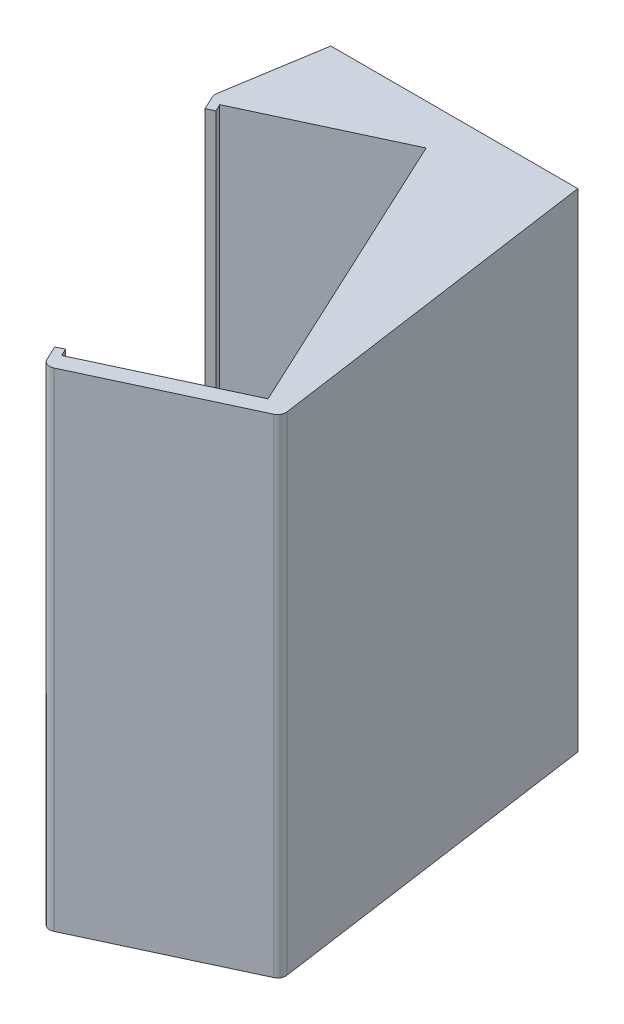
ISO-10303-21;
HEADER;
FILE_DESCRIPTION(('STEP AP214'),'2;1');
FILE_NAME('part.step','',(''),(''),'','','');
FILE_SCHEMA(('AUTOMOTIVE_DESIGN { 1 0 10303 214 1 1 1 1 }'));
ENDSEC;
DATA;
#1=APPLICATION_CONTEXT('core data for automotive mechanical design processes');
#2=APPLICATION_PROTOCOL_DEFINITION('international standard','automotive_design',2000,#1);
#3=PRODUCT_CONTEXT('',#1,'mechanical');
#4=PRODUCT('Part','Part','',(#3));
#5=PRODUCT_RELATED_PRODUCT_CATEGORY('part','',(#4));
#6=PRODUCT_DEFINITION_FORMATION('','',#4);
#7=PRODUCT_DEFINITION_CONTEXT('part definition',#1,'design');
#8=PRODUCT_DEFINITION('design','',#6,#7);
#9=PRODUCT_DEFINITION_SHAPE('','',#8);
#10=(LENGTH_UNIT() NAMED_UNIT(*) SI_UNIT(.MILLI.,.METRE.));
#11=(NAMED_UNIT(*) PLANE_ANGLE_UNIT() SI_UNIT($,.RADIAN.));
#12=(NAMED_UNIT(*) SI_UNIT($,.STERADIAN.) SOLID_ANGLE_UNIT());
#13=UNCERTAINTY_MEASURE_WITH_UNIT(LENGTH_MEASURE(1.E-05),#10,'distance_accuracy_value','');
#14=(GEOMETRIC_REPRESENTATION_CONTEXT(3) GLOBAL_UNCERTAINTY_ASSIGNED_CONTEXT((#13)) GLOBAL_UNIT_ASSIGNED_CONTEXT((#10,
#11,#12)) REPRESENTATION_CONTEXT('',''));
#15=CARTESIAN_POINT('',(0.,0.,0.));
#16=DIRECTION('',(0.,0.,1.));
#17=DIRECTION('',(1.,0.,0.));
#18=AXIS2_PLACEMENT_3D('',#15,#16,#17);
#19=CARTESIAN_POINT('',(-0.321224610422263,60.,44.5055818381207));
#20=DIRECTION('',(-0.906307787036635,0.,0.422618261740732));
#21=DIRECTION('',(0.422618261740732,0.,0.906307787036635));
#22=AXIS2_PLACEMENT_3D('',#19,#20,#21);
#23=PLANE('',#22);
#24=DIRECTION('',(-0.422618261740732,0.,-0.906307787036635));
#25=VECTOR('',#24,1.);
#26=CARTESIAN_POINT('',(-0.321224610422263,0.,44.5055818381207));
#27=LINE('',#26,#25);
#28=CARTESIAN_POINT('',(-0.321224610422263,0.,44.5055818381207));
#29=VERTEX_POINT('',#28);
#30=CARTESIAN_POINT('',(-0.743842872162994,0.,43.5992740510841));
#31=VERTEX_POINT('',#30);
#32=EDGE_CURVE('E178',#29,#31,#27,.T.);
#33=ORIENTED_EDGE('',*,*,#32,.T.);
#34=DIRECTION('',(0.,-1.,0.));
#35=VECTOR('',#34,1.);
#36=CARTESIAN_POINT('',(-0.743842872162994,60.,43.5992740510841));
#37=LINE('',#36,#35);
#38=CARTESIAN_POINT('',(-0.743842872162994,60.,43.5992740510841));
#39=VERTEX_POINT('',#38);
#40=EDGE_CURVE('E156',#39,#31,#37,.T.);
#41=ORIENTED_EDGE('',*,*,#40,.F.);
#42=DIRECTION('',(-0.422618261740732,0.,-0.906307787036635));
#43=VECTOR('',#42,1.);
#44=CARTESIAN_POINT('',(-0.321224610422263,60.,44.5055818381207));
#45=LINE('',#44,#43);
#46=CARTESIAN_POINT('',(-0.321224610422263,60.,44.5055818381207));
#47=VERTEX_POINT('',#46);
#48=EDGE_CURVE('E162',#47,#39,#45,.T.);
#49=ORIENTED_EDGE('',*,*,#48,.F.);
#50=DIRECTION('',(0.,-1.,0.));
#51=VECTOR('',#50,1.);
#52=CARTESIAN_POINT('',(-0.321224610422263,60.,44.5055818381207));
#53=LINE('',#52,#51);
#54=EDGE_CURVE('E232',#47,#29,#53,.T.);
#55=ORIENTED_EDGE('',*,*,#54,.T.);
#56=EDGE_LOOP('',(#33,#41,#49,#55));
#57=FACE_BOUND('',#56,.T.);
#58=ADVANCED_FACE('F39',(#57),#23,.F.);
#59=CARTESIAN_POINT('',(-0.743842872162994,60.,43.5992740510841));
#60=DIRECTION('',(0.422618261740733,0.,0.906307787036634));
#61=DIRECTION('',(0.906307787036634,0.,-0.422618261740733));
#62=AXIS2_PLACEMENT_3D('',#59,#60,#61);
#63=PLANE('',#62);
#64=DIRECTION('',(-0.906307787036634,0.,0.422618261740733));
#65=VECTOR('',#64,1.);
#66=CARTESIAN_POINT('',(-0.743842872162994,0.,43.5992740510841));
#67=LINE('',#66,#65);
#68=CARTESIAN_POINT('',(-1.65015065919963,0.,44.0218923128248));
#69=VERTEX_POINT('',#68);
#70=EDGE_CURVE('E269',#31,#69,#67,.T.);
#71=ORIENTED_EDGE('',*,*,#70,.T.);
#72=DIRECTION('',(0.,-1.,0.));
#73=VECTOR('',#72,1.);
#74=CARTESIAN_POINT('',(-1.65015065919963,60.,44.0218923128248));
#75=LINE('',#74,#73);
#76=CARTESIAN_POINT('',(-1.65015065919963,60.,44.0218923128248));
#77=VERTEX_POINT('',#76);
#78=EDGE_CURVE('E157',#77,#69,#75,.T.);
#79=ORIENTED_EDGE('',*,*,#78,.F.);
#80=DIRECTION('',(-0.906307787036634,0.,0.422618261740733));
#81=VECTOR('',#80,1.);
#82=CARTESIAN_POINT('',(-0.743842872162994,60.,43.5992740510841));
#83=LINE('',#82,#81);
#84=EDGE_CURVE('E155',#39,#77,#83,.T.);
#85=ORIENTED_EDGE('',*,*,#84,.F.);
#86=ORIENTED_EDGE('',*,*,#40,.T.);
#87=EDGE_LOOP('',(#71,#79,#85,#86));
#88=FACE_BOUND('',#87,.T.);
#89=ADVANCED_FACE('F152',(#88),#63,.F.);
#90=CARTESIAN_POINT('',(-1.65015065919963,60.,44.0218923128248));
#91=DIRECTION('',(0.906307787036634,0.,-0.422618261740734));
#92=DIRECTION('',(-0.422618261740734,0.,-0.906307787036634));
#93=AXIS2_PLACEMENT_3D('',#90,#91,#92);
#94=PLANE('',#93);
#95=DIRECTION('',(0.422618261740734,0.,0.906307787036634));
#96=VECTOR('',#95,1.);
#97=CARTESIAN_POINT('',(-1.65015065919963,0.,44.0218923128248));
#98=LINE('',#97,#96);
#99=CARTESIAN_POINT('',(-0.804914135718137,0.,45.8345078868981));
#100=VERTEX_POINT('',#99);
#101=EDGE_CURVE('E270',#69,#100,#98,.T.);
#102=ORIENTED_EDGE('',*,*,#101,.T.);
#103=DIRECTION('',(0.,-1.,0.));
#104=VECTOR('',#103,1.);
#105=CARTESIAN_POINT('',(-0.804914135718136,60.,45.8345078868981));
#106=LINE('',#105,#104);
#107=CARTESIAN_POINT('',(-0.804914135718137,60.,45.8345078868981));
#108=VERTEX_POINT('',#107);
#109=EDGE_CURVE('E11',#100,#108,#106,.F.);
#110=ORIENTED_EDGE('',*,*,#109,.T.);
#111=DIRECTION('',(0.422618261740734,0.,0.906307787036634));
#112=VECTOR('',#111,1.);
#113=CARTESIAN_POINT('',(-1.65015065919963,60.,44.0218923128248));
#114=LINE('',#113,#112);
#115=EDGE_CURVE('E165',#77,#108,#114,.T.);
#116=ORIENTED_EDGE('',*,*,#115,.F.);
#117=ORIENTED_EDGE('',*,*,#78,.T.);
#118=EDGE_LOOP('',(#102,#110,#116,#117));
#119=FACE_BOUND('',#118,.T.);
#120=ADVANCED_FACE('F325',(#119),#94,.F.);
#121=CARTESIAN_POINT('',(-0.382295873977423,60.,46.7408156739347));
#122=DIRECTION('',(-0.42261826174069,0.,-0.906307787036654));
#123=DIRECTION('',(-0.906307787036654,0.,0.42261826174069));
#124=AXIS2_PLACEMENT_3D('',#121,#122,#123);
#125=PLANE('',#124);
#126=DIRECTION('',(0.906307787036654,0.,-0.42261826174069));
#127=VECTOR('',#126,1.);
#128=CARTESIAN_POINT('',(-0.382295873977423,0.,46.7408156739347));
#129=LINE('',#128,#127);
#130=CARTESIAN_POINT('',(0.524011913059188,0.,46.318197412194));
#131=VERTEX_POINT('',#130);
#132=CARTESIAN_POINT('',(18.9758096712909,0.,37.7139828108036));
#133=VERTEX_POINT('',#132);
#134=EDGE_CURVE('E265',#131,#133,#129,.T.);
#135=ORIENTED_EDGE('',*,*,#134,.T.);
#136=DIRECTION('',(0.,-1.,0.));
#137=VECTOR('',#136,1.);
#138=CARTESIAN_POINT('',(18.9758096712909,60.,37.7139828108036));
#139=LINE('',#138,#137);
#140=CARTESIAN_POINT('',(18.9758096712909,60.,37.7139828108036));
#141=VERTEX_POINT('',#140);
#142=EDGE_CURVE('E195',#133,#141,#139,.F.);
#143=ORIENTED_EDGE('',*,*,#142,.T.);
#144=DIRECTION('',(0.906307787036654,0.,-0.42261826174069));
#145=VECTOR('',#144,1.);
#146=CARTESIAN_POINT('',(-0.382295873977423,60.,46.7408156739347));
#147=LINE('',#146,#145);
#148=CARTESIAN_POINT('',(0.524011913059188,60.,46.318197412194));
#149=VERTEX_POINT('',#148);
#150=EDGE_CURVE('E287',#149,#141,#147,.T.);
#151=ORIENTED_EDGE('',*,*,#150,.F.);
#152=DIRECTION('',(0.,-1.,0.));
#153=VECTOR('',#152,1.);
#154=CARTESIAN_POINT('',(0.524011913059188,60.,46.318197412194));
#155=LINE('',#154,#153);
#156=EDGE_CURVE('E193',#149,#131,#155,.T.);
#157=ORIENTED_EDGE('',*,*,#156,.T.);
#158=EDGE_LOOP('',(#135,#143,#151,#157));
#159=FACE_BOUND('',#158,.T.);
#160=ADVANCED_FACE('F297',(#159),#125,.F.);
#161=CARTESIAN_POINT('',(19.6471062123607,60.,37.4009520928098));
#162=DIRECTION('',(-0.990135884384228,0.,0.140110422362728));
#163=DIRECTION('',(0.140110422362728,0.,0.990135884384228));
#164=AXIS2_PLACEMENT_3D('',#161,#162,#163);
#165=PLANE('',#164);
#166=DIRECTION('',(-0.140110422362728,0.,-0.990135884384228));
#167=VECTOR('',#166,1.);
#168=CARTESIAN_POINT('',(19.6471062123607,60.,37.4009520928098));
#169=LINE('',#168,#167);
#170=CARTESIAN_POINT('',(19.5433272939344,60.,36.6675646014042));
#171=VERTEX_POINT('',#170);
#172=CARTESIAN_POINT('',(13.6471062123606,60.,-5.));
#173=VERTEX_POINT('',#172);
#174=EDGE_CURVE('E288',#171,#173,#169,.T.);
#175=ORIENTED_EDGE('',*,*,#174,.F.);
#176=DIRECTION('',(0.,-1.,0.));
#177=VECTOR('',#176,1.);
#178=CARTESIAN_POINT('',(19.5433272939344,60.,36.6675646014042));
#179=LINE('',#178,#177);
#180=CARTESIAN_POINT('',(19.5433272939344,0.,36.6675646014042));
#181=VERTEX_POINT('',#180);
#182=EDGE_CURVE('E179',#171,#181,#179,.T.);
#183=ORIENTED_EDGE('',*,*,#182,.T.);
#184=DIRECTION('',(-0.140110422362728,0.,-0.990135884384228));
#185=VECTOR('',#184,1.);
#186=CARTESIAN_POINT('',(19.6471062123607,0.,37.4009520928098));
#187=LINE('',#186,#185);
#188=CARTESIAN_POINT('',(13.6471062123606,0.,-5.));
#189=VERTEX_POINT('',#188);
#190=EDGE_CURVE('E261',#181,#189,#187,.T.);
#191=ORIENTED_EDGE('',*,*,#190,.T.);
#192=DIRECTION('',(0.,-1.,0.));
#193=VECTOR('',#192,1.);
#194=CARTESIAN_POINT('',(13.6471062123606,60.,-5.));
#195=LINE('',#194,#193);
#196=EDGE_CURVE('E185',#173,#189,#195,.T.);
#197=ORIENTED_EDGE('',*,*,#196,.F.);
#198=EDGE_LOOP('',(#175,#183,#191,#197));
#199=FACE_BOUND('',#198,.T.);
#200=ADVANCED_FACE('F301',(#199),#165,.F.);
#201=CARTESIAN_POINT('',(13.6471062123606,60.,-5.));
#202=DIRECTION('',(0.,0.,1.));
#203=DIRECTION('',(1.,0.,0.));
#204=AXIS2_PLACEMENT_3D('',#201,#202,#203);
#205=PLANE('',#204);
#206=DIRECTION('',(-1.,0.,0.));
#207=VECTOR('',#206,1.);
#208=CARTESIAN_POINT('',(13.6471062123606,0.,-5.));
#209=LINE('',#208,#207);
#210=CARTESIAN_POINT('',(-16.7267835740057,0.,-5.));
#211=VERTEX_POINT('',#210);
#212=EDGE_CURVE('E224',#189,#211,#209,.T.);
#213=ORIENTED_EDGE('',*,*,#212,.T.);
#214=DIRECTION('',(0.,-1.,0.));
#215=VECTOR('',#214,1.);
#216=CARTESIAN_POINT('',(-16.7267835740057,60.,-5.));
#217=LINE('',#216,#215);
#218=CARTESIAN_POINT('',(-16.7267835740057,60.,-5.));
#219=VERTEX_POINT('',#218);
#220=EDGE_CURVE('E250',#219,#211,#217,.T.);
#221=ORIENTED_EDGE('',*,*,#220,.F.);
#222=DIRECTION('',(-1.,0.,0.));
#223=VECTOR('',#222,1.);
#224=CARTESIAN_POINT('',(13.6471062123606,60.,-5.));
#225=LINE('',#224,#223);
#226=EDGE_CURVE('E256',#173,#219,#225,.T.);
#227=ORIENTED_EDGE('',*,*,#226,.F.);
#228=ORIENTED_EDGE('',*,*,#196,.T.);
#229=EDGE_LOOP('',(#213,#221,#227,#228));
#230=FACE_BOUND('',#229,.T.);
#231=ADVANCED_FACE('F258',(#230),#205,.F.);
#232=CARTESIAN_POINT('',(-18.7267835740057,60.,7.40093484802536));
#233=DIRECTION('',(0.987243007651359,0.,0.159220739363623));
#234=DIRECTION('',(0.159220739363623,0.,-0.987243007651359));
#235=AXIS2_PLACEMENT_3D('',#232,#233,#234);
#236=PLANE('',#235);
#237=DIRECTION('',(-0.159220739363623,0.,0.987243007651359));
#238=VECTOR('',#237,1.);
#239=CARTESIAN_POINT('',(-18.7267835740057,0.,7.40093484802536));
#240=LINE('',#239,#238);
#241=CARTESIAN_POINT('',(-18.6778591742979,0.,7.09758070139748));
#242=VERTEX_POINT('',#241);
#243=EDGE_CURVE('E218',#211,#242,#240,.T.);
#244=ORIENTED_EDGE('',*,*,#243,.T.);
#245=DIRECTION('',(0.,-1.,0.));
#246=VECTOR('',#245,1.);
#247=CARTESIAN_POINT('',(-18.6778591742979,60.,7.09758070139748));
#248=LINE('',#247,#246);
#249=CARTESIAN_POINT('',(-18.6778591742979,60.,7.09758070139748));
#250=VERTEX_POINT('',#249);
#251=EDGE_CURVE('E50',#242,#250,#248,.F.);
#252=ORIENTED_EDGE('',*,*,#251,.T.);
#253=DIRECTION('',(-0.159220739363623,0.,0.987243007651359));
#254=VECTOR('',#253,1.);
#255=CARTESIAN_POINT('',(-18.7267835740057,60.,7.40093484802536));
#256=LINE('',#255,#254);
#257=EDGE_CURVE('E282',#219,#250,#256,.T.);
#258=ORIENTED_EDGE('',*,*,#257,.F.);
#259=ORIENTED_EDGE('',*,*,#220,.T.);
#260=EDGE_LOOP('',(#244,#252,#258,#259));
#261=FACE_BOUND('',#260,.T.);
#262=ADVANCED_FACE('F308',(#261),#236,.F.);
#263=CARTESIAN_POINT('',(-17.7941682576956,60.,9.40093484802536));
#264=DIRECTION('',(0.906307787036634,0.,-0.422618261740733));
#265=DIRECTION('',(-0.422618261740733,0.,-0.906307787036634));
#266=AXIS2_PLACEMENT_3D('',#263,#264,#265);
#267=PLANE('',#266);
#268=DIRECTION('',(0.422618261740733,0.,0.906307787036634));
#269=VECTOR('',#268,1.);
#270=CARTESIAN_POINT('',(-17.7941682576956,60.,9.40093484802536));
#271=LINE('',#270,#269);
#272=CARTESIAN_POINT('',(-18.5969239536831,60.,7.67941970250183));
#273=VERTEX_POINT('',#272);
#274=CARTESIAN_POINT('',(-17.7941682576956,60.,9.40093484802536));
#275=VERTEX_POINT('',#274);
#276=EDGE_CURVE('E209',#273,#275,#271,.T.);
#277=ORIENTED_EDGE('',*,*,#276,.F.);
#278=DIRECTION('',(0.,-1.,0.));
#279=VECTOR('',#278,1.);
#280=CARTESIAN_POINT('',(-18.5969239536831,60.,7.67941970250183));
#281=LINE('',#280,#279);
#282=CARTESIAN_POINT('',(-18.5969239536831,0.,7.67941970250183));
#283=VERTEX_POINT('',#282);
#284=EDGE_CURVE('E203',#273,#283,#281,.T.);
#285=ORIENTED_EDGE('',*,*,#284,.T.);
#286=DIRECTION('',(0.422618261740733,0.,0.906307787036634));
#287=VECTOR('',#286,1.);
#288=CARTESIAN_POINT('',(-17.7941682576956,0.,9.40093484802536));
#289=LINE('',#288,#287);
#290=CARTESIAN_POINT('',(-17.7941682576956,0.,9.40093484802536));
#291=VERTEX_POINT('',#290);
#292=EDGE_CURVE('E208',#283,#291,#289,.T.);
#293=ORIENTED_EDGE('',*,*,#292,.T.);
#294=DIRECTION('',(0.,-1.,0.));
#295=VECTOR('',#294,1.);
#296=CARTESIAN_POINT('',(-17.7941682576956,60.,9.40093484802536));
#297=LINE('',#296,#295);
#298=EDGE_CURVE('E249',#275,#291,#297,.T.);
#299=ORIENTED_EDGE('',*,*,#298,.F.);
#300=EDGE_LOOP('',(#277,#285,#293,#299));
#301=FACE_BOUND('',#300,.T.);
#302=ADVANCED_FACE('F206',(#301),#267,.F.);
#303=CARTESIAN_POINT('',(-17.7941682576956,60.,9.40093484802536));
#304=DIRECTION('',(-0.422618261740731,0.,-0.906307787036635));
#305=DIRECTION('',(-0.906307787036635,0.,0.422618261740731));
#306=AXIS2_PLACEMENT_3D('',#303,#304,#305);
#307=PLANE('',#306);
#308=DIRECTION('',(0.906307787036635,0.,-0.422618261740731));
#309=VECTOR('',#308,1.);
#310=CARTESIAN_POINT('',(-17.7941682576956,0.,9.40093484802536));
#311=LINE('',#310,#309);
#312=CARTESIAN_POINT('',(-16.887860470659,0.,8.97831658628463));
#313=VERTEX_POINT('',#312);
#314=EDGE_CURVE('E217',#291,#313,#311,.T.);
#315=ORIENTED_EDGE('',*,*,#314,.T.);
#316=DIRECTION('',(0.,-1.,0.));
#317=VECTOR('',#316,1.);
#318=CARTESIAN_POINT('',(-16.887860470659,60.,8.97831658628463));
#319=LINE('',#318,#317);
#320=CARTESIAN_POINT('',(-16.887860470659,60.,8.97831658628463));
#321=VERTEX_POINT('',#320);
#322=EDGE_CURVE('E243',#321,#313,#319,.T.);
#323=ORIENTED_EDGE('',*,*,#322,.F.);
#324=DIRECTION('',(0.906307787036635,0.,-0.422618261740731));
#325=VECTOR('',#324,1.);
#326=CARTESIAN_POINT('',(-17.7941682576956,60.,9.40093484802536));
#327=LINE('',#326,#325);
#328=EDGE_CURVE('E278',#275,#321,#327,.T.);
#329=ORIENTED_EDGE('',*,*,#328,.F.);
#330=ORIENTED_EDGE('',*,*,#298,.T.);
#331=EDGE_LOOP('',(#315,#323,#329,#330));
#332=FACE_BOUND('',#331,.T.);
#333=ADVANCED_FACE('F311',(#332),#307,.F.);
#334=CARTESIAN_POINT('',(-16.887860470659,60.,8.97831658628463));
#335=DIRECTION('',(-0.906307787036634,0.,0.422618261740733));
#336=DIRECTION('',(0.422618261740733,0.,0.906307787036635));
#337=AXIS2_PLACEMENT_3D('',#334,#335,#336);
#338=PLANE('',#337);
#339=DIRECTION('',(-0.422618261740733,0.,-0.906307787036635));
#340=VECTOR('',#339,1.);
#341=CARTESIAN_POINT('',(-16.887860470659,0.,8.97831658628463));
#342=LINE('',#341,#340);
#343=CARTESIAN_POINT('',(-17.3104787323997,0.,8.072008799248));
#344=VERTEX_POINT('',#343);
#345=EDGE_CURVE('E222',#313,#344,#342,.T.);
#346=ORIENTED_EDGE('',*,*,#345,.T.);
#347=DIRECTION('',(0.,-1.,0.));
#348=VECTOR('',#347,1.);
#349=CARTESIAN_POINT('',(-17.3104787323997,60.,8.072008799248));
#350=LINE('',#349,#348);
#351=CARTESIAN_POINT('',(-17.3104787323997,60.,8.072008799248));
#352=VERTEX_POINT('',#351);
#353=EDGE_CURVE('E241',#352,#344,#350,.T.);
#354=ORIENTED_EDGE('',*,*,#353,.F.);
#355=DIRECTION('',(-0.422618261740733,0.,-0.906307787036635));
#356=VECTOR('',#355,1.);
#357=CARTESIAN_POINT('',(-16.887860470659,60.,8.97831658628463));
#358=LINE('',#357,#356);
#359=EDGE_CURVE('E279',#321,#352,#358,.T.);
#360=ORIENTED_EDGE('',*,*,#359,.F.);
#361=ORIENTED_EDGE('',*,*,#322,.T.);
#362=EDGE_LOOP('',(#346,#354,#360,#361));
#363=FACE_BOUND('',#362,.T.);
#364=ADVANCED_FACE('F395',(#363),#338,.F.);
#365=CARTESIAN_POINT('',(-17.3104787323997,60.,8.072008799248));
#366=DIRECTION('',(-0.422618261740733,0.,-0.906307787036634));
#367=DIRECTION('',(-0.906307787036634,0.,0.422618261740733));
#368=AXIS2_PLACEMENT_3D('',#365,#366,#367);
#369=PLANE('',#368);
#370=DIRECTION('',(0.906307787036634,0.,-0.422618261740733));
#371=VECTOR('',#370,1.);
#372=CARTESIAN_POINT('',(-17.3104787323997,0.,8.072008799248));
#373=LINE('',#372,#371);
#374=CARTESIAN_POINT('',(0.,0.,0.));
#375=VERTEX_POINT('',#374);
#376=EDGE_CURVE('E227',#344,#375,#373,.T.);
#377=ORIENTED_EDGE('',*,*,#376,.T.);
#378=DIRECTION('',(0.,-1.,0.));
#379=VECTOR('',#378,1.);
#380=CARTESIAN_POINT('',(0.,60.,0.));
#381=LINE('',#380,#379);
#382=CARTESIAN_POINT('',(0.,60.,0.));
#383=VERTEX_POINT('',#382);
#384=EDGE_CURVE('E236',#383,#375,#381,.T.);
#385=ORIENTED_EDGE('',*,*,#384,.F.);
#386=DIRECTION('',(0.906307787036634,0.,-0.422618261740733));
#387=VECTOR('',#386,1.);
#388=CARTESIAN_POINT('',(-17.3104787323997,60.,8.072008799248));
#389=LINE('',#388,#387);
#390=EDGE_CURVE('E277',#352,#383,#389,.T.);
#391=ORIENTED_EDGE('',*,*,#390,.F.);
#392=ORIENTED_EDGE('',*,*,#353,.T.);
#393=EDGE_LOOP('',(#377,#385,#391,#392));
#394=FACE_BOUND('',#393,.T.);
#395=ADVANCED_FACE('F385',(#394),#369,.F.);
#396=CARTESIAN_POINT('',(0.,60.,0.));
#397=DIRECTION('',(0.906307787036634,0.,-0.422618261740733));
#398=DIRECTION('',(-0.422618261740733,0.,-0.906307787036634));
#399=AXIS2_PLACEMENT_3D('',#396,#397,#398);
#400=PLANE('',#399);
#401=DIRECTION('',(0.422618261740733,0.,0.906307787036634));
#402=VECTOR('',#401,1.);
#403=CARTESIAN_POINT('',(0.,0.,0.));
#404=LINE('',#403,#402);
#405=CARTESIAN_POINT('',(16.9892541219775,0.,36.4335730388727));
#406=VERTEX_POINT('',#405);
#407=EDGE_CURVE('E229',#375,#406,#404,.T.);
#408=ORIENTED_EDGE('',*,*,#407,.T.);
#409=DIRECTION('',(0.,-1.,0.));
#410=VECTOR('',#409,1.);
#411=CARTESIAN_POINT('',(16.9892541219775,60.,36.4335730388727));
#412=LINE('',#411,#410);
#413=CARTESIAN_POINT('',(16.9892541219775,60.,36.4335730388727));
#414=VERTEX_POINT('',#413);
#415=EDGE_CURVE('E231',#414,#406,#412,.T.);
#416=ORIENTED_EDGE('',*,*,#415,.F.);
#417=DIRECTION('',(0.422618261740733,0.,0.906307787036634));
#418=VECTOR('',#417,1.);
#419=CARTESIAN_POINT('',(0.,60.,0.));
#420=LINE('',#419,#418);
#421=EDGE_CURVE('E273',#383,#414,#420,.T.);
#422=ORIENTED_EDGE('',*,*,#421,.F.);
#423=ORIENTED_EDGE('',*,*,#384,.T.);
#424=EDGE_LOOP('',(#408,#416,#422,#423));
#425=FACE_BOUND('',#424,.T.);
#426=ADVANCED_FACE('F371',(#425),#400,.F.);
#427=CARTESIAN_POINT('',(16.9892541219775,60.,36.4335730388727));
#428=DIRECTION('',(0.422618261740733,0.,0.906307787036634));
#429=DIRECTION('',(0.906307787036634,0.,-0.422618261740733));
#430=AXIS2_PLACEMENT_3D('',#427,#428,#429);
#431=PLANE('',#430);
#432=DIRECTION('',(-0.906307787036634,0.,0.422618261740733));
#433=VECTOR('',#432,1.);
#434=CARTESIAN_POINT('',(16.9892541219775,0.,36.4335730388727));
#435=LINE('',#434,#433);
#436=EDGE_CURVE('E172',#406,#29,#435,.T.);
#437=ORIENTED_EDGE('',*,*,#436,.T.);
#438=ORIENTED_EDGE('',*,*,#54,.F.);
#439=DIRECTION('',(-0.906307787036634,0.,0.422618261740733));
#440=VECTOR('',#439,1.);
#441=CARTESIAN_POINT('',(16.9892541219775,60.,36.4335730388727));
#442=LINE('',#441,#440);
#443=EDGE_CURVE('E166',#414,#47,#442,.T.);
#444=ORIENTED_EDGE('',*,*,#443,.F.);
#445=ORIENTED_EDGE('',*,*,#415,.T.);
#446=EDGE_LOOP('',(#437,#438,#444,#445));
#447=FACE_BOUND('',#446,.T.);
#448=ADVANCED_FACE('F362',(#447),#431,.F.);
#449=CARTESIAN_POINT('',(0.,60.,0.));
#450=DIRECTION('',(0.,1.,0.));
#451=DIRECTION('',(0.,0.,1.));
#452=AXIS2_PLACEMENT_3D('',#449,#450,#451);
#453=PLANE('',#452);
#454=ORIENTED_EDGE('',*,*,#150,.T.);
#455=CARTESIAN_POINT('',(18.5531914095502,60.,36.8076750237669));
#456=DIRECTION('',(0.,1.,0.));
#457=DIRECTION('',(0.,0.,1.));
#458=AXIS2_PLACEMENT_3D('',#455,#456,#457);
#459=CIRCLE('',#458,1.);
#460=EDGE_CURVE('E200',#141,#171,#459,.T.);
#461=ORIENTED_EDGE('',*,*,#460,.T.);
#462=ORIENTED_EDGE('',*,*,#174,.T.);
#463=ORIENTED_EDGE('',*,*,#226,.T.);
#464=ORIENTED_EDGE('',*,*,#257,.T.);
#465=CARTESIAN_POINT('',(-17.6906161666465,60.,7.2568014407611));
#466=DIRECTION('',(0.,1.,0.));
#467=DIRECTION('',(0.,0.,1.));
#468=AXIS2_PLACEMENT_3D('',#465,#466,#467);
#469=CIRCLE('',#468,1.);
#470=EDGE_CURVE('E53',#250,#273,#469,.T.);
#471=ORIENTED_EDGE('',*,*,#470,.T.);
#472=ORIENTED_EDGE('',*,*,#276,.T.);
#473=ORIENTED_EDGE('',*,*,#328,.T.);
#474=ORIENTED_EDGE('',*,*,#359,.T.);
#475=ORIENTED_EDGE('',*,*,#390,.T.);
#476=ORIENTED_EDGE('',*,*,#421,.T.);
#477=ORIENTED_EDGE('',*,*,#443,.T.);
#478=ORIENTED_EDGE('',*,*,#48,.T.);
#479=ORIENTED_EDGE('',*,*,#84,.T.);
#480=ORIENTED_EDGE('',*,*,#115,.T.);
#481=CARTESIAN_POINT('',(0.101393651318498,60.,45.4118896251574));
#482=DIRECTION('',(0.,1.,0.));
#483=DIRECTION('',(0.,0.,1.));
#484=AXIS2_PLACEMENT_3D('',#481,#482,#483);
#485=CIRCLE('',#484,1.);
#486=EDGE_CURVE('E198',#108,#149,#485,.T.);
#487=ORIENTED_EDGE('',*,*,#486,.T.);
#488=EDGE_LOOP('',(#454,#461,#462,#463,#464,#471,#472,#473,#474,#475,#476,#477,#478,#479,#480,#487));
#489=FACE_BOUND('',#488,.T.);
#490=ADVANCED_FACE('F170',(#489),#453,.T.);
#491=CARTESIAN_POINT('',(0.,0.,0.));
#492=DIRECTION('',(0.,1.,0.));
#493=DIRECTION('',(0.,0.,1.));
#494=AXIS2_PLACEMENT_3D('',#491,#492,#493);
#495=PLANE('',#494);
#496=ORIENTED_EDGE('',*,*,#190,.F.);
#497=CARTESIAN_POINT('',(18.5531914095502,0.,36.8076750237669));
#498=DIRECTION('',(0.,1.,0.));
#499=DIRECTION('',(0.,0.,1.));
#500=AXIS2_PLACEMENT_3D('',#497,#498,#499);
#501=CIRCLE('',#500,1.);
#502=EDGE_CURVE('E188',#181,#133,#501,.F.);
#503=ORIENTED_EDGE('',*,*,#502,.T.);
#504=ORIENTED_EDGE('',*,*,#134,.F.);
#505=CARTESIAN_POINT('',(0.101393651318498,0.,45.4118896251574));
#506=DIRECTION('',(0.,1.,0.));
#507=DIRECTION('',(0.,0.,1.));
#508=AXIS2_PLACEMENT_3D('',#505,#506,#507);
#509=CIRCLE('',#508,1.);
#510=EDGE_CURVE('E176',#131,#100,#509,.F.);
#511=ORIENTED_EDGE('',*,*,#510,.T.);
#512=ORIENTED_EDGE('',*,*,#101,.F.);
#513=ORIENTED_EDGE('',*,*,#70,.F.);
#514=ORIENTED_EDGE('',*,*,#32,.F.);
#515=ORIENTED_EDGE('',*,*,#436,.F.);
#516=ORIENTED_EDGE('',*,*,#407,.F.);
#517=ORIENTED_EDGE('',*,*,#376,.F.);
#518=ORIENTED_EDGE('',*,*,#345,.F.);
#519=ORIENTED_EDGE('',*,*,#314,.F.);
#520=ORIENTED_EDGE('',*,*,#292,.F.);
#521=CARTESIAN_POINT('',(-17.6906161666465,0.,7.2568014407611));
#522=DIRECTION('',(0.,1.,0.));
#523=DIRECTION('',(0.,0.,1.));
#524=AXIS2_PLACEMENT_3D('',#521,#522,#523);
#525=CIRCLE('',#524,1.);
#526=EDGE_CURVE('E190',#283,#242,#525,.F.);
#527=ORIENTED_EDGE('',*,*,#526,.T.);
#528=ORIENTED_EDGE('',*,*,#243,.F.);
#529=ORIENTED_EDGE('',*,*,#212,.F.);
#530=EDGE_LOOP('',(#496,#503,#504,#511,#512,#513,#514,#515,#516,#517,#518,#519,#520,#527,#528,#529));
#531=FACE_BOUND('',#530,.T.);
#532=ADVANCED_FACE('F214',(#531),#495,.F.);
#533=CARTESIAN_POINT('',(18.5531914095502,60.,36.8076750237669));
#534=DIRECTION('',(0.,-1.,0.));
#535=DIRECTION('',(0.,0.,-1.));
#536=AXIS2_PLACEMENT_3D('',#533,#534,#535);
#537=CYLINDRICAL_SURFACE('',#536,1.);
#538=ORIENTED_EDGE('',*,*,#460,.F.);
#539=ORIENTED_EDGE('',*,*,#142,.F.);
#540=ORIENTED_EDGE('',*,*,#502,.F.);
#541=ORIENTED_EDGE('',*,*,#182,.F.);
#542=EDGE_LOOP('',(#538,#539,#540,#541));
#543=FACE_BOUND('',#542,.T.);
#544=ADVANCED_FACE('F305',(#543),#537,.T.);
#545=CARTESIAN_POINT('',(-17.6906161666465,60.,7.2568014407611));
#546=DIRECTION('',(0.,-1.,0.));
#547=DIRECTION('',(0.,0.,-1.));
#548=AXIS2_PLACEMENT_3D('',#545,#546,#547);
#549=CYLINDRICAL_SURFACE('',#548,1.);
#550=ORIENTED_EDGE('',*,*,#470,.F.);
#551=ORIENTED_EDGE('',*,*,#251,.F.);
#552=ORIENTED_EDGE('',*,*,#526,.F.);
#553=ORIENTED_EDGE('',*,*,#284,.F.);
#554=EDGE_LOOP('',(#550,#551,#552,#553));
#555=FACE_BOUND('',#554,.T.);
#556=ADVANCED_FACE('F330',(#555),#549,.T.);
#557=CARTESIAN_POINT('',(0.101393651318498,60.,45.4118896251574));
#558=DIRECTION('',(0.,-1.,0.));
#559=DIRECTION('',(0.,0.,-1.));
#560=AXIS2_PLACEMENT_3D('',#557,#558,#559);
#561=CYLINDRICAL_SURFACE('',#560,1.);
#562=ORIENTED_EDGE('',*,*,#486,.F.);
#563=ORIENTED_EDGE('',*,*,#109,.F.);
#564=ORIENTED_EDGE('',*,*,#510,.F.);
#565=ORIENTED_EDGE('',*,*,#156,.F.);
#566=EDGE_LOOP('',(#562,#563,#564,#565));
#567=FACE_BOUND('',#566,.T.);
#568=ADVANCED_FACE('F41',(#567),#561,.T.);
#569=CLOSED_SHELL('',(#58,#89,#120,#160,#200,#231,#262,#302,#333,#364,#395,#426,#448,#490,#532,
#544,#556,#568));
#570=MANIFOLD_SOLID_BREP('B2',#569);
#571=ADVANCED_BREP_SHAPE_REPRESENTATION('',(#18,#570),#14);
#572=SHAPE_DEFINITION_REPRESENTATION(#9,#571);
ENDSEC;
END-ISO-10303-21;
